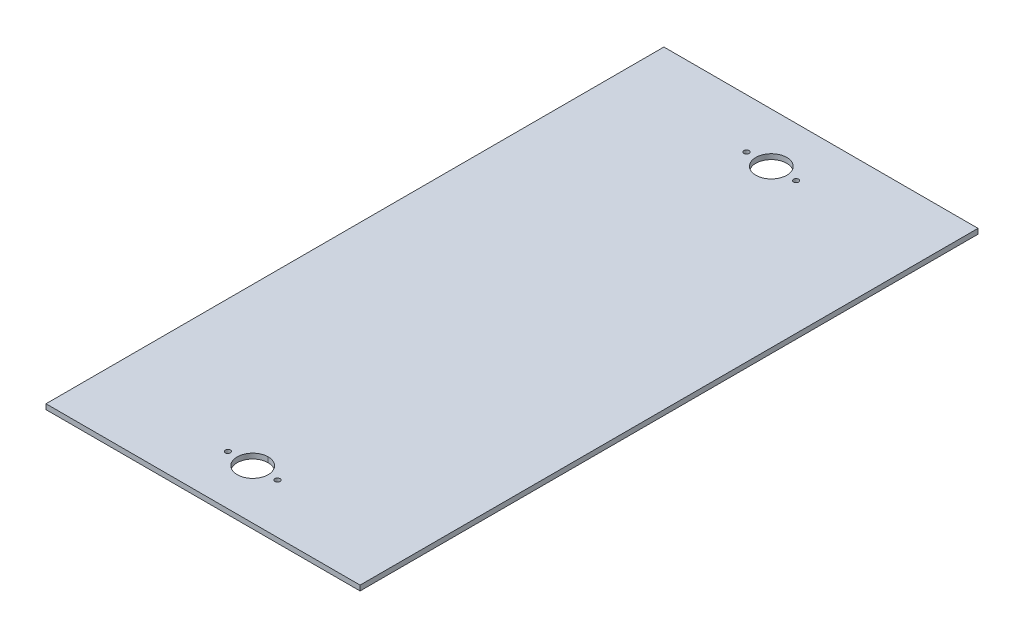
ISO-10303-21;
HEADER;
FILE_DESCRIPTION(('STEP AP214'),'2;1');
FILE_NAME('part.step','',(''),(''),'','','');
FILE_SCHEMA(('AUTOMOTIVE_DESIGN { 1 0 10303 214 1 1 1 1 }'));
ENDSEC;
DATA;
#1=APPLICATION_CONTEXT('core data for automotive mechanical design processes');
#2=APPLICATION_PROTOCOL_DEFINITION('international standard','automotive_design',2000,#1);
#3=PRODUCT_CONTEXT('',#1,'mechanical');
#4=PRODUCT('Part','Part','',(#3));
#5=PRODUCT_RELATED_PRODUCT_CATEGORY('part','',(#4));
#6=PRODUCT_DEFINITION_FORMATION('','',#4);
#7=PRODUCT_DEFINITION_CONTEXT('part definition',#1,'design');
#8=PRODUCT_DEFINITION('design','',#6,#7);
#9=PRODUCT_DEFINITION_SHAPE('','',#8);
#10=(LENGTH_UNIT() NAMED_UNIT(*) SI_UNIT(.MILLI.,.METRE.));
#11=(NAMED_UNIT(*) PLANE_ANGLE_UNIT() SI_UNIT($,.RADIAN.));
#12=(NAMED_UNIT(*) SI_UNIT($,.STERADIAN.) SOLID_ANGLE_UNIT());
#13=UNCERTAINTY_MEASURE_WITH_UNIT(LENGTH_MEASURE(1.E-05),#10,'distance_accuracy_value','');
#14=(GEOMETRIC_REPRESENTATION_CONTEXT(3) GLOBAL_UNCERTAINTY_ASSIGNED_CONTEXT((#13)) GLOBAL_UNIT_ASSIGNED_CONTEXT((#10,
#11,#12)) REPRESENTATION_CONTEXT('',''));
#15=CARTESIAN_POINT('',(0.,0.,0.));
#16=DIRECTION('',(0.,0.,1.));
#17=DIRECTION('',(1.,0.,0.));
#18=AXIS2_PLACEMENT_3D('',#15,#16,#17);
#19=CARTESIAN_POINT('',(91.8972,2.9972,142.6972));
#20=DIRECTION('',(0.,0.,-1.));
#21=DIRECTION('',(-1.,0.,0.));
#22=AXIS2_PLACEMENT_3D('',#19,#20,#21);
#23=PLANE('',#22);
#24=DIRECTION('',(0.,1.,0.));
#25=VECTOR('',#24,1.);
#26=CARTESIAN_POINT('',(-0.300873727667335,-187.701868587822,142.6972));
#27=LINE('',#26,#25);
#28=CARTESIAN_POINT('',(-0.300873727667335,0.,142.6972));
#29=VERTEX_POINT('',#28);
#30=CARTESIAN_POINT('',(-0.300873727667335,2.9972,142.6972));
#31=VERTEX_POINT('',#30);
#32=EDGE_CURVE('E196',#29,#31,#27,.T.);
#33=ORIENTED_EDGE('',*,*,#32,.F.);
#34=DIRECTION('',(-1.,0.,0.));
#35=VECTOR('',#34,1.);
#36=CARTESIAN_POINT('',(91.8972,0.,142.6972));
#37=LINE('',#36,#35);
#38=CARTESIAN_POINT('',(0.300873727667447,0.,142.6972));
#39=VERTEX_POINT('',#38);
#40=EDGE_CURVE('E69',#29,#39,#37,.F.);
#41=ORIENTED_EDGE('',*,*,#40,.T.);
#42=DIRECTION('',(0.,1.,0.));
#43=VECTOR('',#42,1.);
#44=CARTESIAN_POINT('',(0.300873727667447,-187.701868587822,142.6972));
#45=LINE('',#44,#43);
#46=CARTESIAN_POINT('',(0.300873727667447,2.9972,142.6972));
#47=VERTEX_POINT('',#46);
#48=EDGE_CURVE('E146',#39,#47,#45,.T.);
#49=ORIENTED_EDGE('',*,*,#48,.T.);
#50=DIRECTION('',(-1.,0.,0.));
#51=VECTOR('',#50,1.);
#52=CARTESIAN_POINT('',(91.8972,2.9972,142.6972));
#53=LINE('',#52,#51);
#54=EDGE_CURVE('E12',#31,#47,#53,.F.);
#55=ORIENTED_EDGE('',*,*,#54,.F.);
#56=EDGE_LOOP('',(#33,#41,#49,#55));
#57=FACE_BOUND('',#56,.T.);
#58=ADVANCED_FACE('F61',(#57),#23,.F.);
#59=CARTESIAN_POINT('',(91.8972,2.9972,-142.6972));
#60=DIRECTION('',(0.,0.,1.));
#61=DIRECTION('',(1.,0.,0.));
#62=AXIS2_PLACEMENT_3D('',#59,#60,#61);
#63=PLANE('',#62);
#64=DIRECTION('',(0.,1.,0.));
#65=VECTOR('',#64,1.);
#66=CARTESIAN_POINT('',(0.300873727666536,-187.701868587822,-142.6972));
#67=LINE('',#66,#65);
#68=CARTESIAN_POINT('',(0.300873727666749,0.,-142.6972));
#69=VERTEX_POINT('',#68);
#70=CARTESIAN_POINT('',(0.300873727666749,2.9972,-142.6972));
#71=VERTEX_POINT('',#70);
#72=EDGE_CURVE('E182',#69,#71,#67,.T.);
#73=ORIENTED_EDGE('',*,*,#72,.F.);
#74=DIRECTION('',(1.,0.,0.));
#75=VECTOR('',#74,1.);
#76=CARTESIAN_POINT('',(91.8972,0.,-142.6972));
#77=LINE('',#76,#75);
#78=CARTESIAN_POINT('',(-0.300873727666747,0.,-142.6972));
#79=VERTEX_POINT('',#78);
#80=EDGE_CURVE('E180',#69,#79,#77,.F.);
#81=ORIENTED_EDGE('',*,*,#80,.T.);
#82=DIRECTION('',(0.,1.,0.));
#83=VECTOR('',#82,1.);
#84=CARTESIAN_POINT('',(-0.300873727666534,-187.701868587822,-142.6972));
#85=LINE('',#84,#83);
#86=CARTESIAN_POINT('',(-0.300873727666747,2.9972,-142.6972));
#87=VERTEX_POINT('',#86);
#88=EDGE_CURVE('E176',#79,#87,#85,.T.);
#89=ORIENTED_EDGE('',*,*,#88,.T.);
#90=DIRECTION('',(1.,0.,0.));
#91=VECTOR('',#90,1.);
#92=CARTESIAN_POINT('',(91.8972,2.9972,-142.6972));
#93=LINE('',#92,#91);
#94=EDGE_CURVE('E194',#71,#87,#93,.F.);
#95=ORIENTED_EDGE('',*,*,#94,.F.);
#96=EDGE_LOOP('',(#73,#81,#89,#95));
#97=FACE_BOUND('',#96,.T.);
#98=ADVANCED_FACE('F219',(#97),#63,.F.);
#99=CARTESIAN_POINT('',(-91.8972,2.9972,-142.6972));
#100=DIRECTION('',(1.,0.,0.));
#101=DIRECTION('',(0.,0.,-1.));
#102=AXIS2_PLACEMENT_3D('',#99,#100,#101);
#103=PLANE('',#102);
#104=DIRECTION('',(0.,0.,1.));
#105=VECTOR('',#104,1.);
#106=CARTESIAN_POINT('',(-91.8972,0.,-142.6972));
#107=LINE('',#106,#105);
#108=CARTESIAN_POINT('',(-91.8972,0.,-180.7972));
#109=VERTEX_POINT('',#108);
#110=CARTESIAN_POINT('',(-91.8972,0.,180.7972));
#111=VERTEX_POINT('',#110);
#112=EDGE_CURVE('E135',#109,#111,#107,.T.);
#113=ORIENTED_EDGE('',*,*,#112,.T.);
#114=DIRECTION('',(0.,1.,0.));
#115=VECTOR('',#114,1.);
#116=CARTESIAN_POINT('',(-91.8972,-187.701868587822,180.7972));
#117=LINE('',#116,#115);
#118=CARTESIAN_POINT('',(-91.8972,2.9972,180.7972));
#119=VERTEX_POINT('',#118);
#120=EDGE_CURVE('E145',#111,#119,#117,.T.);
#121=ORIENTED_EDGE('',*,*,#120,.T.);
#122=DIRECTION('',(0.,0.,1.));
#123=VECTOR('',#122,1.);
#124=CARTESIAN_POINT('',(-91.8972,2.9972,-142.6972));
#125=LINE('',#124,#123);
#126=CARTESIAN_POINT('',(-91.8972,2.9972,-180.7972));
#127=VERTEX_POINT('',#126);
#128=EDGE_CURVE('E134',#127,#119,#125,.T.);
#129=ORIENTED_EDGE('',*,*,#128,.F.);
#130=DIRECTION('',(0.,1.,0.));
#131=VECTOR('',#130,1.);
#132=CARTESIAN_POINT('',(-91.8972,-187.701868587822,-180.7972));
#133=LINE('',#132,#131);
#134=EDGE_CURVE('E159',#109,#127,#133,.T.);
#135=ORIENTED_EDGE('',*,*,#134,.F.);
#136=EDGE_LOOP('',(#113,#121,#129,#135));
#137=FACE_BOUND('',#136,.T.);
#138=ADVANCED_FACE('F63',(#137),#103,.F.);
#139=CARTESIAN_POINT('',(91.8972,2.9972,-142.6972));
#140=DIRECTION('',(-1.,0.,0.));
#141=DIRECTION('',(0.,0.,1.));
#142=AXIS2_PLACEMENT_3D('',#139,#140,#141);
#143=PLANE('',#142);
#144=DIRECTION('',(0.,0.,-1.));
#145=VECTOR('',#144,1.);
#146=CARTESIAN_POINT('',(91.8972,0.,-142.6972));
#147=LINE('',#146,#145);
#148=CARTESIAN_POINT('',(91.8972000000001,0.,180.7972));
#149=VERTEX_POINT('',#148);
#150=CARTESIAN_POINT('',(91.8972,0.,-180.7972));
#151=VERTEX_POINT('',#150);
#152=EDGE_CURVE('E123',#149,#151,#147,.T.);
#153=ORIENTED_EDGE('',*,*,#152,.T.);
#154=DIRECTION('',(0.,1.,0.));
#155=VECTOR('',#154,1.);
#156=CARTESIAN_POINT('',(91.8972,-187.701868587822,-180.7972));
#157=LINE('',#156,#155);
#158=CARTESIAN_POINT('',(91.8972,2.9972,-180.7972));
#159=VERTEX_POINT('',#158);
#160=EDGE_CURVE('E158',#151,#159,#157,.T.);
#161=ORIENTED_EDGE('',*,*,#160,.T.);
#162=DIRECTION('',(0.,0.,-1.));
#163=VECTOR('',#162,1.);
#164=CARTESIAN_POINT('',(91.8972,2.9972,-142.6972));
#165=LINE('',#164,#163);
#166=CARTESIAN_POINT('',(91.8972000000001,2.9972,180.7972));
#167=VERTEX_POINT('',#166);
#168=EDGE_CURVE('E149',#167,#159,#165,.T.);
#169=ORIENTED_EDGE('',*,*,#168,.F.);
#170=DIRECTION('',(0.,1.,0.));
#171=VECTOR('',#170,1.);
#172=CARTESIAN_POINT('',(91.8972000000001,-187.701868587822,180.7972));
#173=LINE('',#172,#171);
#174=EDGE_CURVE('E142',#149,#167,#173,.T.);
#175=ORIENTED_EDGE('',*,*,#174,.F.);
#176=EDGE_LOOP('',(#153,#161,#169,#175));
#177=FACE_BOUND('',#176,.T.);
#178=ADVANCED_FACE('F148',(#177),#143,.F.);
#179=CARTESIAN_POINT('',(0.,2.9972,0.));
#180=DIRECTION('',(0.,-1.,0.));
#181=DIRECTION('',(0.,0.,-1.));
#182=AXIS2_PLACEMENT_3D('',#179,#180,#181);
#183=PLANE('',#182);
#184=DIRECTION('',(1.,0.,0.));
#185=VECTOR('',#184,1.);
#186=CARTESIAN_POINT('',(0.,2.9972,180.7972));
#187=LINE('',#186,#185);
#188=EDGE_CURVE('E239',#119,#167,#187,.T.);
#189=ORIENTED_EDGE('',*,*,#188,.T.);
#190=ORIENTED_EDGE('',*,*,#168,.T.);
#191=DIRECTION('',(1.,0.,0.));
#192=VECTOR('',#191,1.);
#193=CARTESIAN_POINT('',(0.,2.9972,-180.7972));
#194=LINE('',#193,#192);
#195=EDGE_CURVE('E155',#127,#159,#194,.T.);
#196=ORIENTED_EDGE('',*,*,#195,.F.);
#197=ORIENTED_EDGE('',*,*,#128,.T.);
#198=EDGE_LOOP('',(#189,#190,#196,#197));
#199=FACE_BOUND('',#198,.T.);
#200=CARTESIAN_POINT('',(0.,2.9972,151.7472));
#201=DIRECTION('',(0.,1.,0.));
#202=DIRECTION('',(0.,0.,1.));
#203=AXIS2_PLACEMENT_3D('',#200,#201,#202);
#204=CIRCLE('',#203,9.055);
#205=EDGE_CURVE('E198',#31,#47,#204,.T.);
#206=ORIENTED_EDGE('',*,*,#205,.F.);
#207=ORIENTED_EDGE('',*,*,#54,.T.);
#208=EDGE_LOOP('',(#206,#207));
#209=FACE_BOUND('',#208,.T.);
#210=CARTESIAN_POINT('',(0.,2.9972,-151.7472));
#211=DIRECTION('',(0.,1.,0.));
#212=DIRECTION('',(0.,0.,1.));
#213=AXIS2_PLACEMENT_3D('',#210,#211,#212);
#214=CIRCLE('',#213,9.055);
#215=EDGE_CURVE('E185',#71,#87,#214,.T.);
#216=ORIENTED_EDGE('',*,*,#215,.F.);
#217=ORIENTED_EDGE('',*,*,#94,.T.);
#218=EDGE_LOOP('',(#216,#217));
#219=FACE_BOUND('',#218,.T.);
#220=CARTESIAN_POINT('',(14.5050000000001,2.9972,-151.7472));
#221=DIRECTION('',(0.,1.,0.));
#222=DIRECTION('',(0.,0.,1.));
#223=AXIS2_PLACEMENT_3D('',#220,#221,#222);
#224=CIRCLE('',#223,1.5);
#225=CARTESIAN_POINT('',(14.5050000000001,2.9972,-150.2472));
#226=VERTEX_POINT('',#225);
#227=EDGE_CURVE('E163',#226,#226,#224,.T.);
#228=ORIENTED_EDGE('',*,*,#227,.F.);
#229=EDGE_LOOP('',(#228));
#230=FACE_BOUND('',#229,.T.);
#231=CARTESIAN_POINT('',(-14.5050000000001,2.9972,-151.7472));
#232=DIRECTION('',(0.,1.,0.));
#233=DIRECTION('',(0.,0.,1.));
#234=AXIS2_PLACEMENT_3D('',#231,#232,#233);
#235=CIRCLE('',#234,1.5);
#236=CARTESIAN_POINT('',(-14.5050000000001,2.9972,-150.2472));
#237=VERTEX_POINT('',#236);
#238=EDGE_CURVE('E160',#237,#237,#235,.T.);
#239=ORIENTED_EDGE('',*,*,#238,.F.);
#240=EDGE_LOOP('',(#239));
#241=FACE_BOUND('',#240,.T.);
#242=CARTESIAN_POINT('',(14.5050000000001,2.9972,151.7472));
#243=DIRECTION('',(0.,1.,0.));
#244=DIRECTION('',(0.,0.,1.));
#245=AXIS2_PLACEMENT_3D('',#242,#243,#244);
#246=CIRCLE('',#245,1.5);
#247=CARTESIAN_POINT('',(14.5050000000001,2.9972,153.2472));
#248=VERTEX_POINT('',#247);
#249=EDGE_CURVE('E234',#248,#248,#246,.T.);
#250=ORIENTED_EDGE('',*,*,#249,.F.);
#251=EDGE_LOOP('',(#250));
#252=FACE_BOUND('',#251,.T.);
#253=CARTESIAN_POINT('',(-14.5050000000001,2.9972,151.7472));
#254=DIRECTION('',(0.,1.,0.));
#255=DIRECTION('',(0.,0.,1.));
#256=AXIS2_PLACEMENT_3D('',#253,#254,#255);
#257=CIRCLE('',#256,1.5);
#258=CARTESIAN_POINT('',(-14.5050000000001,2.9972,153.2472));
#259=VERTEX_POINT('',#258);
#260=EDGE_CURVE('E151',#259,#259,#257,.T.);
#261=ORIENTED_EDGE('',*,*,#260,.F.);
#262=EDGE_LOOP('',(#261));
#263=FACE_BOUND('',#262,.T.);
#264=ADVANCED_FACE('F213',(#199,#209,#219,#230,#241,#252,#263),#183,.F.);
#265=CARTESIAN_POINT('',(0.,0.,0.));
#266=DIRECTION('',(0.,-1.,0.));
#267=DIRECTION('',(0.,0.,-1.));
#268=AXIS2_PLACEMENT_3D('',#265,#266,#267);
#269=PLANE('',#268);
#270=ORIENTED_EDGE('',*,*,#40,.F.);
#271=CARTESIAN_POINT('',(0.,0.,151.7472));
#272=DIRECTION('',(0.,-1.,0.));
#273=DIRECTION('',(0.,0.,-1.));
#274=AXIS2_PLACEMENT_3D('',#271,#272,#273);
#275=CIRCLE('',#274,9.055);
#276=EDGE_CURVE('E199',#29,#39,#275,.F.);
#277=ORIENTED_EDGE('',*,*,#276,.T.);
#278=EDGE_LOOP('',(#270,#277));
#279=FACE_BOUND('',#278,.T.);
#280=ORIENTED_EDGE('',*,*,#80,.F.);
#281=CARTESIAN_POINT('',(0.,0.,-151.7472));
#282=DIRECTION('',(0.,-1.,0.));
#283=DIRECTION('',(0.,0.,-1.));
#284=AXIS2_PLACEMENT_3D('',#281,#282,#283);
#285=CIRCLE('',#284,9.055);
#286=EDGE_CURVE('E172',#69,#79,#285,.F.);
#287=ORIENTED_EDGE('',*,*,#286,.T.);
#288=EDGE_LOOP('',(#280,#287));
#289=FACE_BOUND('',#288,.T.);
#290=ORIENTED_EDGE('',*,*,#152,.F.);
#291=DIRECTION('',(1.,0.,0.));
#292=VECTOR('',#291,1.);
#293=CARTESIAN_POINT('',(0.,0.,180.7972));
#294=LINE('',#293,#292);
#295=EDGE_CURVE('E127',#111,#149,#294,.T.);
#296=ORIENTED_EDGE('',*,*,#295,.F.);
#297=ORIENTED_EDGE('',*,*,#112,.F.);
#298=DIRECTION('',(1.,0.,0.));
#299=VECTOR('',#298,1.);
#300=CARTESIAN_POINT('',(0.,0.,-180.7972));
#301=LINE('',#300,#299);
#302=EDGE_CURVE('E129',#109,#151,#301,.T.);
#303=ORIENTED_EDGE('',*,*,#302,.T.);
#304=EDGE_LOOP('',(#290,#296,#297,#303));
#305=FACE_BOUND('',#304,.T.);
#306=CARTESIAN_POINT('',(14.5050000000001,0.,-151.7472));
#307=DIRECTION('',(0.,-1.,0.));
#308=DIRECTION('',(0.,0.,-1.));
#309=AXIS2_PLACEMENT_3D('',#306,#307,#308);
#310=CIRCLE('',#309,1.5);
#311=CARTESIAN_POINT('',(14.5050000000001,0.,-153.2472));
#312=VERTEX_POINT('',#311);
#313=EDGE_CURVE('E166',#312,#312,#310,.F.);
#314=ORIENTED_EDGE('',*,*,#313,.T.);
#315=EDGE_LOOP('',(#314));
#316=FACE_BOUND('',#315,.T.);
#317=CARTESIAN_POINT('',(-14.5050000000001,0.,-151.7472));
#318=DIRECTION('',(0.,-1.,0.));
#319=DIRECTION('',(0.,0.,-1.));
#320=AXIS2_PLACEMENT_3D('',#317,#318,#319);
#321=CIRCLE('',#320,1.5);
#322=CARTESIAN_POINT('',(-14.5050000000001,0.,-153.2472));
#323=VERTEX_POINT('',#322);
#324=EDGE_CURVE('E167',#323,#323,#321,.F.);
#325=ORIENTED_EDGE('',*,*,#324,.T.);
#326=EDGE_LOOP('',(#325));
#327=FACE_BOUND('',#326,.T.);
#328=CARTESIAN_POINT('',(14.5050000000001,0.,151.7472));
#329=DIRECTION('',(0.,-1.,0.));
#330=DIRECTION('',(0.,0.,-1.));
#331=AXIS2_PLACEMENT_3D('',#328,#329,#330);
#332=CIRCLE('',#331,1.5);
#333=CARTESIAN_POINT('',(14.5050000000001,0.,150.2472));
#334=VERTEX_POINT('',#333);
#335=EDGE_CURVE('E202',#334,#334,#332,.F.);
#336=ORIENTED_EDGE('',*,*,#335,.T.);
#337=EDGE_LOOP('',(#336));
#338=FACE_BOUND('',#337,.T.);
#339=CARTESIAN_POINT('',(-14.5050000000001,0.,151.7472));
#340=DIRECTION('',(0.,-1.,0.));
#341=DIRECTION('',(0.,0.,-1.));
#342=AXIS2_PLACEMENT_3D('',#339,#340,#341);
#343=CIRCLE('',#342,1.5);
#344=CARTESIAN_POINT('',(-14.5050000000001,0.,150.2472));
#345=VERTEX_POINT('',#344);
#346=EDGE_CURVE('E186',#345,#345,#343,.F.);
#347=ORIENTED_EDGE('',*,*,#346,.T.);
#348=EDGE_LOOP('',(#347));
#349=FACE_BOUND('',#348,.T.);
#350=ADVANCED_FACE('F125',(#279,#289,#305,#316,#327,#338,#349),#269,.T.);
#351=CARTESIAN_POINT('',(0.,-187.701868587822,-151.7472));
#352=DIRECTION('',(0.,1.,0.));
#353=DIRECTION('',(0.,0.,1.));
#354=AXIS2_PLACEMENT_3D('',#351,#352,#353);
#355=CYLINDRICAL_SURFACE('',#354,9.055);
#356=ORIENTED_EDGE('',*,*,#286,.F.);
#357=ORIENTED_EDGE('',*,*,#72,.T.);
#358=ORIENTED_EDGE('',*,*,#215,.T.);
#359=ORIENTED_EDGE('',*,*,#88,.F.);
#360=EDGE_LOOP('',(#356,#357,#358,#359));
#361=FACE_BOUND('',#360,.T.);
#362=ADVANCED_FACE('F212',(#361),#355,.F.);
#363=CARTESIAN_POINT('',(0.,-187.701868587822,-180.7972));
#364=DIRECTION('',(0.,0.,1.));
#365=DIRECTION('',(1.,0.,0.));
#366=AXIS2_PLACEMENT_3D('',#363,#364,#365);
#367=PLANE('',#366);
#368=ORIENTED_EDGE('',*,*,#302,.F.);
#369=ORIENTED_EDGE('',*,*,#134,.T.);
#370=ORIENTED_EDGE('',*,*,#195,.T.);
#371=ORIENTED_EDGE('',*,*,#160,.F.);
#372=EDGE_LOOP('',(#368,#369,#370,#371));
#373=FACE_BOUND('',#372,.T.);
#374=ADVANCED_FACE('F251',(#373),#367,.F.);
#375=CARTESIAN_POINT('',(-14.5050000000001,-187.701868587822,-151.7472));
#376=DIRECTION('',(0.,1.,0.));
#377=DIRECTION('',(0.,0.,1.));
#378=AXIS2_PLACEMENT_3D('',#375,#376,#377);
#379=CYLINDRICAL_SURFACE('',#378,1.5);
#380=ORIENTED_EDGE('',*,*,#238,.T.);
#381=EDGE_LOOP('',(#380));
#382=FACE_BOUND('',#381,.T.);
#383=ORIENTED_EDGE('',*,*,#324,.F.);
#384=EDGE_LOOP('',(#383));
#385=FACE_BOUND('',#384,.T.);
#386=ADVANCED_FACE('F253',(#382,#385),#379,.F.);
#387=CARTESIAN_POINT('',(14.5050000000001,-187.701868587822,-151.7472));
#388=DIRECTION('',(0.,1.,0.));
#389=DIRECTION('',(0.,0.,1.));
#390=AXIS2_PLACEMENT_3D('',#387,#388,#389);
#391=CYLINDRICAL_SURFACE('',#390,1.5);
#392=ORIENTED_EDGE('',*,*,#227,.T.);
#393=EDGE_LOOP('',(#392));
#394=FACE_BOUND('',#393,.T.);
#395=ORIENTED_EDGE('',*,*,#313,.F.);
#396=EDGE_LOOP('',(#395));
#397=FACE_BOUND('',#396,.T.);
#398=ADVANCED_FACE('F259',(#394,#397),#391,.F.);
#399=CARTESIAN_POINT('',(0.,-187.701868587822,151.7472));
#400=DIRECTION('',(0.,1.,0.));
#401=DIRECTION('',(0.,0.,1.));
#402=AXIS2_PLACEMENT_3D('',#399,#400,#401);
#403=CYLINDRICAL_SURFACE('',#402,9.055);
#404=ORIENTED_EDGE('',*,*,#276,.F.);
#405=ORIENTED_EDGE('',*,*,#32,.T.);
#406=ORIENTED_EDGE('',*,*,#205,.T.);
#407=ORIENTED_EDGE('',*,*,#48,.F.);
#408=EDGE_LOOP('',(#404,#405,#406,#407));
#409=FACE_BOUND('',#408,.T.);
#410=ADVANCED_FACE('F209',(#409),#403,.F.);
#411=CARTESIAN_POINT('',(0.,-187.701868587822,180.7972));
#412=DIRECTION('',(0.,0.,1.));
#413=DIRECTION('',(1.,0.,0.));
#414=AXIS2_PLACEMENT_3D('',#411,#412,#413);
#415=PLANE('',#414);
#416=ORIENTED_EDGE('',*,*,#120,.F.);
#417=ORIENTED_EDGE('',*,*,#295,.T.);
#418=ORIENTED_EDGE('',*,*,#174,.T.);
#419=ORIENTED_EDGE('',*,*,#188,.F.);
#420=EDGE_LOOP('',(#416,#417,#418,#419));
#421=FACE_BOUND('',#420,.T.);
#422=ADVANCED_FACE('F140',(#421),#415,.T.);
#423=CARTESIAN_POINT('',(-14.5050000000001,-187.701868587822,151.7472));
#424=DIRECTION('',(0.,1.,0.));
#425=DIRECTION('',(0.,0.,1.));
#426=AXIS2_PLACEMENT_3D('',#423,#424,#425);
#427=CYLINDRICAL_SURFACE('',#426,1.5);
#428=ORIENTED_EDGE('',*,*,#260,.T.);
#429=EDGE_LOOP('',(#428));
#430=FACE_BOUND('',#429,.T.);
#431=ORIENTED_EDGE('',*,*,#346,.F.);
#432=EDGE_LOOP('',(#431));
#433=FACE_BOUND('',#432,.T.);
#434=ADVANCED_FACE('F370',(#430,#433),#427,.F.);
#435=CARTESIAN_POINT('',(14.5050000000001,-187.701868587822,151.7472));
#436=DIRECTION('',(0.,1.,0.));
#437=DIRECTION('',(0.,0.,1.));
#438=AXIS2_PLACEMENT_3D('',#435,#436,#437);
#439=CYLINDRICAL_SURFACE('',#438,1.5);
#440=ORIENTED_EDGE('',*,*,#249,.T.);
#441=EDGE_LOOP('',(#440));
#442=FACE_BOUND('',#441,.T.);
#443=ORIENTED_EDGE('',*,*,#335,.F.);
#444=EDGE_LOOP('',(#443));
#445=FACE_BOUND('',#444,.T.);
#446=ADVANCED_FACE('F378',(#442,#445),#439,.F.);
#447=CLOSED_SHELL('',(#58,#98,#138,#178,#264,#350,#362,#374,#386,#398,#410,#422,#434,#446));
#448=MANIFOLD_SOLID_BREP('B2',#447);
#449=ADVANCED_BREP_SHAPE_REPRESENTATION('',(#18,#448),#14);
#450=SHAPE_DEFINITION_REPRESENTATION(#9,#449);
ENDSEC;
END-ISO-10303-21;
